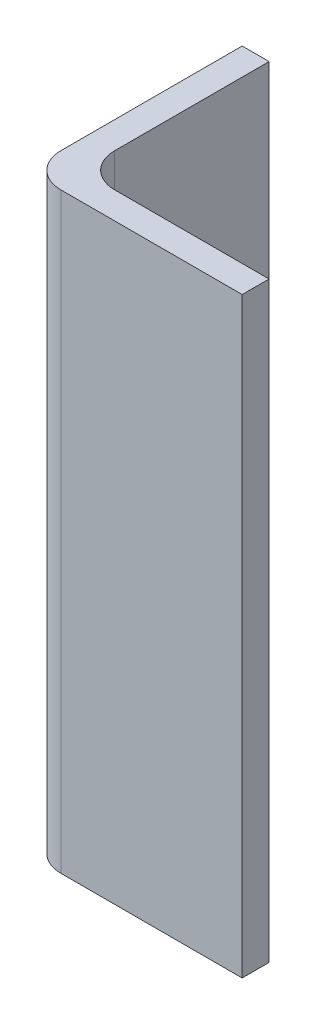
ISO-10303-21;
HEADER;
FILE_DESCRIPTION(('STEP AP214'),'2;1');
FILE_NAME('part.step','',(''),(''),'','','');
FILE_SCHEMA(('AUTOMOTIVE_DESIGN { 1 0 10303 214 1 1 1 1 }'));
ENDSEC;
DATA;
#1=APPLICATION_CONTEXT('core data for automotive mechanical design processes');
#2=APPLICATION_PROTOCOL_DEFINITION('international standard','automotive_design',2000,#1);
#3=PRODUCT_CONTEXT('',#1,'mechanical');
#4=PRODUCT('Part','Part','',(#3));
#5=PRODUCT_RELATED_PRODUCT_CATEGORY('part','',(#4));
#6=PRODUCT_DEFINITION_FORMATION('','',#4);
#7=PRODUCT_DEFINITION_CONTEXT('part definition',#1,'design');
#8=PRODUCT_DEFINITION('design','',#6,#7);
#9=PRODUCT_DEFINITION_SHAPE('','',#8);
#10=(LENGTH_UNIT() NAMED_UNIT(*) SI_UNIT(.MILLI.,.METRE.));
#11=(NAMED_UNIT(*) PLANE_ANGLE_UNIT() SI_UNIT($,.RADIAN.));
#12=(NAMED_UNIT(*) SI_UNIT($,.STERADIAN.) SOLID_ANGLE_UNIT());
#13=UNCERTAINTY_MEASURE_WITH_UNIT(LENGTH_MEASURE(1.E-05),#10,'distance_accuracy_value','');
#14=(GEOMETRIC_REPRESENTATION_CONTEXT(3) GLOBAL_UNCERTAINTY_ASSIGNED_CONTEXT((#13)) GLOBAL_UNIT_ASSIGNED_CONTEXT((#10,
#11,#12)) REPRESENTATION_CONTEXT('',''));
#15=CARTESIAN_POINT('',(0.,0.,0.));
#16=DIRECTION('',(0.,0.,1.));
#17=DIRECTION('',(1.,0.,0.));
#18=AXIS2_PLACEMENT_3D('',#15,#16,#17);
#19=CARTESIAN_POINT('',(-7.9433301054421,34.925,-9.79778819955743));
#20=DIRECTION('',(1.,0.,0.));
#21=DIRECTION('',(0.,0.,-1.));
#22=AXIS2_PLACEMENT_3D('',#19,#20,#21);
#23=PLANE('',#22);
#24=DIRECTION('',(0.,0.,1.));
#25=VECTOR('',#24,1.);
#26=CARTESIAN_POINT('',(-7.9433301054421,0.,-9.79778819955743));
#27=LINE('',#26,#25);
#28=CARTESIAN_POINT('',(-7.9433301054421,0.,-9.79778819955743));
#29=VERTEX_POINT('',#28);
#30=CARTESIAN_POINT('',(-7.9433301054421,0.,0.902211800442573));
#31=VERTEX_POINT('',#30);
#32=EDGE_CURVE('E132',#29,#31,#27,.T.);
#33=ORIENTED_EDGE('',*,*,#32,.T.);
#34=DIRECTION('',(0.,-1.,0.));
#35=VECTOR('',#34,1.);
#36=CARTESIAN_POINT('',(-7.9433301054421,34.925,0.902211800442573));
#37=LINE('',#36,#35);
#38=CARTESIAN_POINT('',(-7.9433301054421,34.925,0.902211800442573));
#39=VERTEX_POINT('',#38);
#40=EDGE_CURVE('E41',#31,#39,#37,.F.);
#41=ORIENTED_EDGE('',*,*,#40,.T.);
#42=DIRECTION('',(0.,0.,1.));
#43=VECTOR('',#42,1.);
#44=CARTESIAN_POINT('',(-7.9433301054421,34.925,-9.79778819955743));
#45=LINE('',#44,#43);
#46=CARTESIAN_POINT('',(-7.9433301054421,34.925,-9.79778819955743));
#47=VERTEX_POINT('',#46);
#48=EDGE_CURVE('E108',#47,#39,#45,.T.);
#49=ORIENTED_EDGE('',*,*,#48,.F.);
#50=DIRECTION('',(0.,-1.,0.));
#51=VECTOR('',#50,1.);
#52=CARTESIAN_POINT('',(-7.9433301054421,34.925,-9.79778819955743));
#53=LINE('',#52,#51);
#54=EDGE_CURVE('E131',#47,#29,#53,.T.);
#55=ORIENTED_EDGE('',*,*,#54,.T.);
#56=EDGE_LOOP('',(#33,#41,#49,#55));
#57=FACE_BOUND('',#56,.T.);
#58=ADVANCED_FACE('F33',(#57),#23,.F.);
#59=CARTESIAN_POINT('',(-6.3533301054421,34.925,2.90221180044257));
#60=DIRECTION('',(0.,0.,-1.));
#61=DIRECTION('',(-1.,0.,0.));
#62=AXIS2_PLACEMENT_3D('',#59,#60,#61);
#63=PLANE('',#62);
#64=DIRECTION('',(1.,0.,0.));
#65=VECTOR('',#64,1.);
#66=CARTESIAN_POINT('',(-7.9433301054421,34.925,2.90221180044257));
#67=LINE('',#66,#65);
#68=CARTESIAN_POINT('',(-5.9433301054421,34.925,2.90221180044257));
#69=VERTEX_POINT('',#68);
#70=CARTESIAN_POINT('',(4.7566698945579,34.925,2.90221180044257));
#71=VERTEX_POINT('',#70);
#72=EDGE_CURVE('E97',#69,#71,#67,.T.);
#73=ORIENTED_EDGE('',*,*,#72,.F.);
#74=DIRECTION('',(0.,-1.,0.));
#75=VECTOR('',#74,1.);
#76=CARTESIAN_POINT('',(-5.9433301054421,34.925,2.90221180044257));
#77=LINE('',#76,#75);
#78=CARTESIAN_POINT('',(-5.9433301054421,0.,2.90221180044257));
#79=VERTEX_POINT('',#78);
#80=EDGE_CURVE('E158',#69,#79,#77,.T.);
#81=ORIENTED_EDGE('',*,*,#80,.T.);
#82=DIRECTION('',(1.,0.,0.));
#83=VECTOR('',#82,1.);
#84=CARTESIAN_POINT('',(-6.3533301054421,0.,2.90221180044257));
#85=LINE('',#84,#83);
#86=CARTESIAN_POINT('',(4.7566698945579,0.,2.90221180044257));
#87=VERTEX_POINT('',#86);
#88=EDGE_CURVE('E113',#79,#87,#85,.T.);
#89=ORIENTED_EDGE('',*,*,#88,.T.);
#90=DIRECTION('',(0.,-1.,0.));
#91=VECTOR('',#90,1.);
#92=CARTESIAN_POINT('',(4.7566698945579,34.925,2.90221180044257));
#93=LINE('',#92,#91);
#94=EDGE_CURVE('E111',#71,#87,#93,.T.);
#95=ORIENTED_EDGE('',*,*,#94,.F.);
#96=EDGE_LOOP('',(#73,#81,#89,#95));
#97=FACE_BOUND('',#96,.T.);
#98=ADVANCED_FACE('F112',(#97),#63,.F.);
#99=CARTESIAN_POINT('',(4.7566698945579,34.925,2.90221180044257));
#100=DIRECTION('',(-1.,0.,0.));
#101=DIRECTION('',(0.,0.,1.));
#102=AXIS2_PLACEMENT_3D('',#99,#100,#101);
#103=PLANE('',#102);
#104=DIRECTION('',(0.,0.,-1.));
#105=VECTOR('',#104,1.);
#106=CARTESIAN_POINT('',(4.7566698945579,0.,2.90221180044257));
#107=LINE('',#106,#105);
#108=CARTESIAN_POINT('',(4.7566698945579,0.,1.31471180044257));
#109=VERTEX_POINT('',#108);
#110=EDGE_CURVE('E135',#87,#109,#107,.T.);
#111=ORIENTED_EDGE('',*,*,#110,.T.);
#112=DIRECTION('',(0.,-1.,0.));
#113=VECTOR('',#112,1.);
#114=CARTESIAN_POINT('',(4.7566698945579,34.925,1.31471180044257));
#115=LINE('',#114,#113);
#116=CARTESIAN_POINT('',(4.7566698945579,34.925,1.31471180044257));
#117=VERTEX_POINT('',#116);
#118=EDGE_CURVE('E117',#117,#109,#115,.T.);
#119=ORIENTED_EDGE('',*,*,#118,.F.);
#120=DIRECTION('',(0.,0.,-1.));
#121=VECTOR('',#120,1.);
#122=CARTESIAN_POINT('',(4.7566698945579,34.925,2.90221180044257));
#123=LINE('',#122,#121);
#124=EDGE_CURVE('E102',#71,#117,#123,.T.);
#125=ORIENTED_EDGE('',*,*,#124,.F.);
#126=ORIENTED_EDGE('',*,*,#94,.T.);
#127=EDGE_LOOP('',(#111,#119,#125,#126));
#128=FACE_BOUND('',#127,.T.);
#129=ADVANCED_FACE('F119',(#128),#103,.F.);
#130=CARTESIAN_POINT('',(-6.3533301054421,34.925,1.31471180044257));
#131=DIRECTION('',(0.,0.,1.));
#132=DIRECTION('',(1.,0.,0.));
#133=AXIS2_PLACEMENT_3D('',#130,#131,#132);
#134=PLANE('',#133);
#135=DIRECTION('',(-1.,0.,0.));
#136=VECTOR('',#135,1.);
#137=CARTESIAN_POINT('',(-6.3533301054421,0.,1.31471180044257));
#138=LINE('',#137,#136);
#139=CARTESIAN_POINT('',(-4.3533301054421,0.,1.31471180044257));
#140=VERTEX_POINT('',#139);
#141=EDGE_CURVE('E137',#109,#140,#138,.T.);
#142=ORIENTED_EDGE('',*,*,#141,.T.);
#143=DIRECTION('',(0.,-1.,0.));
#144=VECTOR('',#143,1.);
#145=CARTESIAN_POINT('',(-4.3533301054421,34.925,1.31471180044257));
#146=LINE('',#145,#144);
#147=CARTESIAN_POINT('',(-4.3533301054421,34.925,1.31471180044257));
#148=VERTEX_POINT('',#147);
#149=EDGE_CURVE('E152',#140,#148,#146,.F.);
#150=ORIENTED_EDGE('',*,*,#149,.T.);
#151=DIRECTION('',(-1.,0.,0.));
#152=VECTOR('',#151,1.);
#153=CARTESIAN_POINT('',(-6.3533301054421,34.925,1.31471180044257));
#154=LINE('',#153,#152);
#155=EDGE_CURVE('E122',#117,#148,#154,.T.);
#156=ORIENTED_EDGE('',*,*,#155,.F.);
#157=ORIENTED_EDGE('',*,*,#118,.T.);
#158=EDGE_LOOP('',(#142,#150,#156,#157));
#159=FACE_BOUND('',#158,.T.);
#160=ADVANCED_FACE('F164',(#159),#134,.F.);
#161=CARTESIAN_POINT('',(-6.3533301054421,34.925,-9.79778819955743));
#162=DIRECTION('',(-1.,0.,0.));
#163=DIRECTION('',(0.,0.,1.));
#164=AXIS2_PLACEMENT_3D('',#161,#162,#163);
#165=PLANE('',#164);
#166=DIRECTION('',(0.,0.,-1.));
#167=VECTOR('',#166,1.);
#168=CARTESIAN_POINT('',(-6.3533301054421,34.925,-9.79778819955743));
#169=LINE('',#168,#167);
#170=CARTESIAN_POINT('',(-6.3533301054421,34.925,-0.685288199557427));
#171=VERTEX_POINT('',#170);
#172=CARTESIAN_POINT('',(-6.3533301054421,34.925,-9.79778819955743));
#173=VERTEX_POINT('',#172);
#174=EDGE_CURVE('E124',#171,#173,#169,.T.);
#175=ORIENTED_EDGE('',*,*,#174,.F.);
#176=DIRECTION('',(0.,-1.,0.));
#177=VECTOR('',#176,1.);
#178=CARTESIAN_POINT('',(-6.3533301054421,0.,-0.685288199557427));
#179=LINE('',#178,#177);
#180=CARTESIAN_POINT('',(-6.3533301054421,0.,-0.685288199557427));
#181=VERTEX_POINT('',#180);
#182=EDGE_CURVE('E116',#171,#181,#179,.T.);
#183=ORIENTED_EDGE('',*,*,#182,.T.);
#184=DIRECTION('',(0.,0.,-1.));
#185=VECTOR('',#184,1.);
#186=CARTESIAN_POINT('',(-6.3533301054421,0.,-9.79778819955743));
#187=LINE('',#186,#185);
#188=CARTESIAN_POINT('',(-6.3533301054421,0.,-9.79778819955743));
#189=VERTEX_POINT('',#188);
#190=EDGE_CURVE('E140',#181,#189,#187,.T.);
#191=ORIENTED_EDGE('',*,*,#190,.T.);
#192=DIRECTION('',(0.,-1.,0.));
#193=VECTOR('',#192,1.);
#194=CARTESIAN_POINT('',(-6.3533301054421,34.925,-9.79778819955743));
#195=LINE('',#194,#193);
#196=EDGE_CURVE('E146',#173,#189,#195,.T.);
#197=ORIENTED_EDGE('',*,*,#196,.F.);
#198=EDGE_LOOP('',(#175,#183,#191,#197));
#199=FACE_BOUND('',#198,.T.);
#200=ADVANCED_FACE('F173',(#199),#165,.F.);
#201=CARTESIAN_POINT('',(-7.9433301054421,34.925,-9.79778819955743));
#202=DIRECTION('',(0.,0.,1.));
#203=DIRECTION('',(1.,0.,0.));
#204=AXIS2_PLACEMENT_3D('',#201,#202,#203);
#205=PLANE('',#204);
#206=DIRECTION('',(-1.,0.,0.));
#207=VECTOR('',#206,1.);
#208=CARTESIAN_POINT('',(-7.9433301054421,0.,-9.79778819955743));
#209=LINE('',#208,#207);
#210=EDGE_CURVE('E142',#189,#29,#209,.T.);
#211=ORIENTED_EDGE('',*,*,#210,.T.);
#212=ORIENTED_EDGE('',*,*,#54,.F.);
#213=DIRECTION('',(-1.,0.,0.));
#214=VECTOR('',#213,1.);
#215=CARTESIAN_POINT('',(-7.9433301054421,34.925,-9.79778819955743));
#216=LINE('',#215,#214);
#217=EDGE_CURVE('E129',#173,#47,#216,.T.);
#218=ORIENTED_EDGE('',*,*,#217,.F.);
#219=ORIENTED_EDGE('',*,*,#196,.T.);
#220=EDGE_LOOP('',(#211,#212,#218,#219));
#221=FACE_BOUND('',#220,.T.);
#222=ADVANCED_FACE('F178',(#221),#205,.F.);
#223=CARTESIAN_POINT('',(0.,34.925,0.));
#224=DIRECTION('',(0.,1.,0.));
#225=DIRECTION('',(0.,0.,1.));
#226=AXIS2_PLACEMENT_3D('',#223,#224,#225);
#227=PLANE('',#226);
#228=ORIENTED_EDGE('',*,*,#48,.T.);
#229=CARTESIAN_POINT('',(-5.9433301054421,34.925,0.902211800442573));
#230=DIRECTION('',(0.,1.,0.));
#231=DIRECTION('',(0.,0.,1.));
#232=AXIS2_PLACEMENT_3D('',#229,#230,#231);
#233=CIRCLE('',#232,2.);
#234=EDGE_CURVE('E11',#39,#69,#233,.T.);
#235=ORIENTED_EDGE('',*,*,#234,.T.);
#236=ORIENTED_EDGE('',*,*,#72,.T.);
#237=ORIENTED_EDGE('',*,*,#124,.T.);
#238=ORIENTED_EDGE('',*,*,#155,.T.);
#239=CARTESIAN_POINT('',(-4.3533301054421,34.925,-0.685288199557427));
#240=DIRECTION('',(0.,1.,0.));
#241=DIRECTION('',(0.,0.,1.));
#242=AXIS2_PLACEMENT_3D('',#239,#240,#241);
#243=CIRCLE('',#242,2.);
#244=EDGE_CURVE('E156',#148,#171,#243,.F.);
#245=ORIENTED_EDGE('',*,*,#244,.T.);
#246=ORIENTED_EDGE('',*,*,#174,.T.);
#247=ORIENTED_EDGE('',*,*,#217,.T.);
#248=EDGE_LOOP('',(#228,#235,#236,#237,#238,#245,#246,#247));
#249=FACE_BOUND('',#248,.T.);
#250=ADVANCED_FACE('F99',(#249),#227,.T.);
#251=CARTESIAN_POINT('',(0.,0.,0.));
#252=DIRECTION('',(0.,1.,0.));
#253=DIRECTION('',(0.,0.,1.));
#254=AXIS2_PLACEMENT_3D('',#251,#252,#253);
#255=PLANE('',#254);
#256=ORIENTED_EDGE('',*,*,#88,.F.);
#257=CARTESIAN_POINT('',(-5.9433301054421,0.,0.902211800442573));
#258=DIRECTION('',(0.,1.,0.));
#259=DIRECTION('',(0.,0.,1.));
#260=AXIS2_PLACEMENT_3D('',#257,#258,#259);
#261=CIRCLE('',#260,2.);
#262=EDGE_CURVE('E55',#79,#31,#261,.F.);
#263=ORIENTED_EDGE('',*,*,#262,.T.);
#264=ORIENTED_EDGE('',*,*,#32,.F.);
#265=ORIENTED_EDGE('',*,*,#210,.F.);
#266=ORIENTED_EDGE('',*,*,#190,.F.);
#267=CARTESIAN_POINT('',(-4.3533301054421,0.,-0.685288199557427));
#268=DIRECTION('',(0.,1.,0.));
#269=DIRECTION('',(0.,0.,1.));
#270=AXIS2_PLACEMENT_3D('',#267,#268,#269);
#271=CIRCLE('',#270,2.);
#272=EDGE_CURVE('E154',#181,#140,#271,.T.);
#273=ORIENTED_EDGE('',*,*,#272,.T.);
#274=ORIENTED_EDGE('',*,*,#141,.F.);
#275=ORIENTED_EDGE('',*,*,#110,.F.);
#276=EDGE_LOOP('',(#256,#263,#264,#265,#266,#273,#274,#275));
#277=FACE_BOUND('',#276,.T.);
#278=ADVANCED_FACE('F161',(#277),#255,.F.);
#279=CARTESIAN_POINT('',(-4.3533301054421,34.925,-0.685288199557427));
#280=DIRECTION('',(0.,1.,0.));
#281=DIRECTION('',(0.,0.,1.));
#282=AXIS2_PLACEMENT_3D('',#279,#280,#281);
#283=CYLINDRICAL_SURFACE('',#282,2.);
#284=ORIENTED_EDGE('',*,*,#244,.F.);
#285=ORIENTED_EDGE('',*,*,#149,.F.);
#286=ORIENTED_EDGE('',*,*,#272,.F.);
#287=ORIENTED_EDGE('',*,*,#182,.F.);
#288=EDGE_LOOP('',(#284,#285,#286,#287));
#289=FACE_BOUND('',#288,.T.);
#290=ADVANCED_FACE('F170',(#289),#283,.F.);
#291=CARTESIAN_POINT('',(-5.9433301054421,34.925,0.902211800442573));
#292=DIRECTION('',(0.,-1.,0.));
#293=DIRECTION('',(0.,0.,-1.));
#294=AXIS2_PLACEMENT_3D('',#291,#292,#293);
#295=CYLINDRICAL_SURFACE('',#294,2.);
#296=ORIENTED_EDGE('',*,*,#234,.F.);
#297=ORIENTED_EDGE('',*,*,#40,.F.);
#298=ORIENTED_EDGE('',*,*,#262,.F.);
#299=ORIENTED_EDGE('',*,*,#80,.F.);
#300=EDGE_LOOP('',(#296,#297,#298,#299));
#301=FACE_BOUND('',#300,.T.);
#302=ADVANCED_FACE('F35',(#301),#295,.T.);
#303=CLOSED_SHELL('',(#58,#98,#129,#160,#200,#222,#250,#278,#290,#302));
#304=MANIFOLD_SOLID_BREP('B2',#303);
#305=ADVANCED_BREP_SHAPE_REPRESENTATION('',(#18,#304),#14);
#306=SHAPE_DEFINITION_REPRESENTATION(#9,#305);
ENDSEC;
END-ISO-10303-21;
